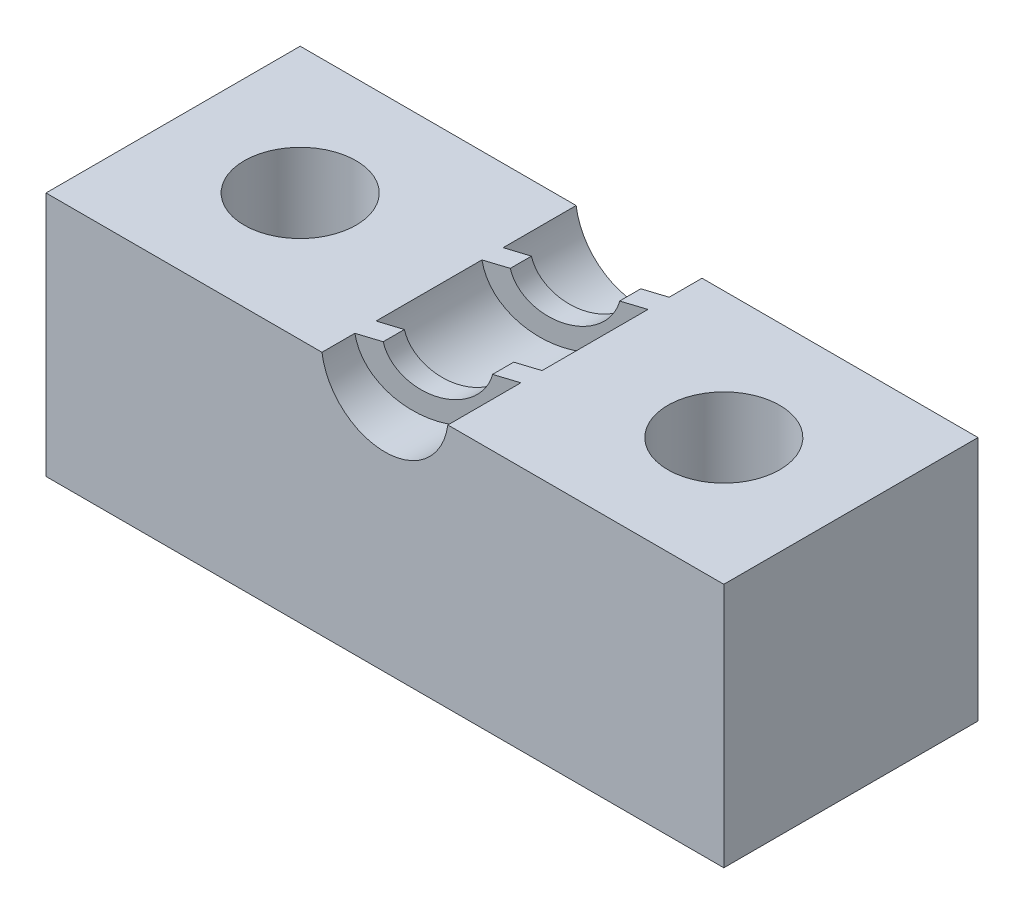
ISO-10303-21;
HEADER;
FILE_DESCRIPTION(('STEP AP214'),'2;1');
FILE_NAME('part.step','',(''),(''),'','','');
FILE_SCHEMA(('AUTOMOTIVE_DESIGN { 1 0 10303 214 1 1 1 1 }'));
ENDSEC;
DATA;
#1=APPLICATION_CONTEXT('core data for automotive mechanical design processes');
#2=APPLICATION_PROTOCOL_DEFINITION('international standard','automotive_design',2000,#1);
#3=PRODUCT_CONTEXT('',#1,'mechanical');
#4=PRODUCT('Part','Part','',(#3));
#5=PRODUCT_RELATED_PRODUCT_CATEGORY('part','',(#4));
#6=PRODUCT_DEFINITION_FORMATION('','',#4);
#7=PRODUCT_DEFINITION_CONTEXT('part definition',#1,'design');
#8=PRODUCT_DEFINITION('design','',#6,#7);
#9=PRODUCT_DEFINITION_SHAPE('','',#8);
#10=(LENGTH_UNIT() NAMED_UNIT(*) SI_UNIT(.MILLI.,.METRE.));
#11=(NAMED_UNIT(*) PLANE_ANGLE_UNIT() SI_UNIT($,.RADIAN.));
#12=(NAMED_UNIT(*) SI_UNIT($,.STERADIAN.) SOLID_ANGLE_UNIT());
#13=UNCERTAINTY_MEASURE_WITH_UNIT(LENGTH_MEASURE(1.E-05),#10,'distance_accuracy_value','');
#14=(GEOMETRIC_REPRESENTATION_CONTEXT(3) GLOBAL_UNCERTAINTY_ASSIGNED_CONTEXT((#13)) GLOBAL_UNIT_ASSIGNED_CONTEXT((#10,
#11,#12)) REPRESENTATION_CONTEXT('',''));
#15=CARTESIAN_POINT('',(0.,0.,0.));
#16=DIRECTION('',(0.,0.,1.));
#17=DIRECTION('',(1.,0.,0.));
#18=AXIS2_PLACEMENT_3D('',#15,#16,#17);
#19=CARTESIAN_POINT('',(0.,0.,3.));
#20=DIRECTION('',(0.,0.,-1.));
#21=DIRECTION('',(-1.,0.,0.));
#22=AXIS2_PLACEMENT_3D('',#19,#20,#21);
#23=CYLINDRICAL_SURFACE('',#22,1.5);
#24=CARTESIAN_POINT('',(0.,0.,-3.));
#25=DIRECTION('',(0.,0.,1.));
#26=DIRECTION('',(1.,0.,0.));
#27=AXIS2_PLACEMENT_3D('',#24,#25,#26);
#28=CIRCLE('',#27,1.5);
#29=CARTESIAN_POINT('',(-1.48607724633712,-0.203898057663877,-3.));
#30=VERTEX_POINT('',#29);
#31=CARTESIAN_POINT('',(1.48607724633711,-0.203898057663877,-3.));
#32=VERTEX_POINT('',#31);
#33=EDGE_CURVE('E178',#30,#32,#28,.T.);
#34=ORIENTED_EDGE('',*,*,#33,.F.);
#35=DIRECTION('',(0.,0.,-1.));
#36=VECTOR('',#35,1.);
#37=CARTESIAN_POINT('',(-1.48607724633712,-0.203898057663877,3.));
#38=LINE('',#37,#36);
#39=CARTESIAN_POINT('',(-1.48607724633712,-0.203898057663876,-1.27687514451344));
#40=VERTEX_POINT('',#39);
#41=EDGE_CURVE('E257',#30,#40,#38,.F.);
#42=ORIENTED_EDGE('',*,*,#41,.T.);
#43=CARTESIAN_POINT('',(0.,0.,-1.75));
#44=DIRECTION('',(-0.303367903708314,0.,-0.952873504196451));
#45=DIRECTION('',(0.952873504196451,0.,-0.303367903708314));
#46=AXIS2_PLACEMENT_3D('',#43,#44,#45);
#47=ELLIPSE('',#46,1.57418586348976,1.5);
#48=CARTESIAN_POINT('',(1.48607724633711,-0.203898057663876,-2.22312485548656));
#49=VERTEX_POINT('',#48);
#50=EDGE_CURVE('E284',#49,#40,#47,.T.);
#51=ORIENTED_EDGE('',*,*,#50,.F.);
#52=DIRECTION('',(0.,0.,-1.));
#53=VECTOR('',#52,1.);
#54=CARTESIAN_POINT('',(1.48607724633711,-0.203898057663877,3.));
#55=LINE('',#54,#53);
#56=EDGE_CURVE('E62',#32,#49,#55,.F.);
#57=ORIENTED_EDGE('',*,*,#56,.F.);
#58=EDGE_LOOP('',(#34,#42,#51,#57));
#59=FACE_BOUND('',#58,.T.);
#60=ADVANCED_FACE('F38',(#59),#23,.F.);
#61=CARTESIAN_POINT('',(0.,0.,1.75));
#62=DIRECTION('',(0.303367903708314,0.,0.952873504196451));
#63=DIRECTION('',(0.952873504196451,0.,-0.303367903708314));
#64=AXIS2_PLACEMENT_3D('',#61,#62,#63);
#65=ELLIPSE('',#64,1.57418586348976,1.5);
#66=CARTESIAN_POINT('',(-1.48607724633712,-0.203898057663877,2.22312485548656));
#67=VERTEX_POINT('',#66);
#68=CARTESIAN_POINT('',(1.48607724633711,-0.203898057663876,1.27687514451344));
#69=VERTEX_POINT('',#68);
#70=EDGE_CURVE('E195',#67,#69,#65,.T.);
#71=ORIENTED_EDGE('',*,*,#70,.F.);
#72=CARTESIAN_POINT('',(-1.48607724633712,-0.203898057663877,3.));
#73=VERTEX_POINT('',#72);
#74=EDGE_CURVE('E262',#67,#73,#38,.F.);
#75=ORIENTED_EDGE('',*,*,#74,.T.);
#76=CARTESIAN_POINT('',(0.,0.,3.));
#77=DIRECTION('',(0.,0.,1.));
#78=DIRECTION('',(1.,0.,0.));
#79=AXIS2_PLACEMENT_3D('',#76,#77,#78);
#80=CIRCLE('',#79,1.5);
#81=CARTESIAN_POINT('',(1.48607724633711,-0.203898057663877,3.));
#82=VERTEX_POINT('',#81);
#83=EDGE_CURVE('E186',#73,#82,#80,.T.);
#84=ORIENTED_EDGE('',*,*,#83,.T.);
#85=EDGE_CURVE('E145',#69,#82,#55,.F.);
#86=ORIENTED_EDGE('',*,*,#85,.F.);
#87=EDGE_LOOP('',(#71,#75,#84,#86));
#88=FACE_BOUND('',#87,.T.);
#89=ADVANCED_FACE('F320',(#88),#23,.F.);
#90=CARTESIAN_POINT('',(0.,0.,3.));
#91=DIRECTION('',(0.,0.,-1.));
#92=DIRECTION('',(-1.,0.,0.));
#93=AXIS2_PLACEMENT_3D('',#90,#91,#92);
#94=PLANE('',#93);
#95=DIRECTION('',(-1.,0.,0.));
#96=VECTOR('',#95,1.);
#97=CARTESIAN_POINT('',(0.,-0.203898057663877,3.));
#98=LINE('',#97,#96);
#99=CARTESIAN_POINT('',(-8.,-0.203898057663878,3.));
#100=VERTEX_POINT('',#99);
#101=EDGE_CURVE('E151',#73,#100,#98,.T.);
#102=ORIENTED_EDGE('',*,*,#101,.T.);
#103=DIRECTION('',(0.,-1.,0.));
#104=VECTOR('',#103,1.);
#105=CARTESIAN_POINT('',(-8.,-6.,3.));
#106=LINE('',#105,#104);
#107=CARTESIAN_POINT('',(-8.,-6.,3.));
#108=VERTEX_POINT('',#107);
#109=EDGE_CURVE('E169',#100,#108,#106,.T.);
#110=ORIENTED_EDGE('',*,*,#109,.T.);
#111=DIRECTION('',(1.,0.,0.));
#112=VECTOR('',#111,1.);
#113=CARTESIAN_POINT('',(-8.,-6.,3.));
#114=LINE('',#113,#112);
#115=CARTESIAN_POINT('',(8.,-6.,3.));
#116=VERTEX_POINT('',#115);
#117=EDGE_CURVE('E166',#108,#116,#114,.T.);
#118=ORIENTED_EDGE('',*,*,#117,.T.);
#119=DIRECTION('',(0.,1.,0.));
#120=VECTOR('',#119,1.);
#121=CARTESIAN_POINT('',(8.,-6.,3.));
#122=LINE('',#121,#120);
#123=CARTESIAN_POINT('',(8.,-0.203898057663877,3.));
#124=VERTEX_POINT('',#123);
#125=EDGE_CURVE('E157',#116,#124,#122,.T.);
#126=ORIENTED_EDGE('',*,*,#125,.T.);
#127=DIRECTION('',(1.,0.,0.));
#128=VECTOR('',#127,1.);
#129=CARTESIAN_POINT('',(0.,-0.203898057663877,3.));
#130=LINE('',#129,#128);
#131=EDGE_CURVE('E139',#82,#124,#130,.T.);
#132=ORIENTED_EDGE('',*,*,#131,.F.);
#133=ORIENTED_EDGE('',*,*,#83,.F.);
#134=EDGE_LOOP('',(#102,#110,#118,#126,#132,#133));
#135=FACE_BOUND('',#134,.T.);
#136=ADVANCED_FACE('F164',(#135),#94,.F.);
#137=CARTESIAN_POINT('',(0.,0.,-3.));
#138=DIRECTION('',(0.,0.,-1.));
#139=DIRECTION('',(-1.,0.,0.));
#140=AXIS2_PLACEMENT_3D('',#137,#138,#139);
#141=PLANE('',#140);
#142=DIRECTION('',(0.,-1.,0.));
#143=VECTOR('',#142,1.);
#144=CARTESIAN_POINT('',(-8.,-6.,-3.));
#145=LINE('',#144,#143);
#146=CARTESIAN_POINT('',(-8.,-0.203898057663878,-3.));
#147=VERTEX_POINT('',#146);
#148=CARTESIAN_POINT('',(-8.,-6.,-3.));
#149=VERTEX_POINT('',#148);
#150=EDGE_CURVE('E175',#147,#149,#145,.T.);
#151=ORIENTED_EDGE('',*,*,#150,.F.);
#152=DIRECTION('',(-1.,0.,0.));
#153=VECTOR('',#152,1.);
#154=CARTESIAN_POINT('',(0.,-0.203898057663877,-3.));
#155=LINE('',#154,#153);
#156=EDGE_CURVE('E230',#30,#147,#155,.T.);
#157=ORIENTED_EDGE('',*,*,#156,.F.);
#158=ORIENTED_EDGE('',*,*,#33,.T.);
#159=DIRECTION('',(1.,0.,0.));
#160=VECTOR('',#159,1.);
#161=CARTESIAN_POINT('',(0.,-0.203898057663877,-3.));
#162=LINE('',#161,#160);
#163=CARTESIAN_POINT('',(8.,-0.203898057663877,-3.));
#164=VERTEX_POINT('',#163);
#165=EDGE_CURVE('E227',#32,#164,#162,.T.);
#166=ORIENTED_EDGE('',*,*,#165,.T.);
#167=DIRECTION('',(0.,1.,0.));
#168=VECTOR('',#167,1.);
#169=CARTESIAN_POINT('',(8.,-6.,-3.));
#170=LINE('',#169,#168);
#171=CARTESIAN_POINT('',(8.,-6.,-3.));
#172=VERTEX_POINT('',#171);
#173=EDGE_CURVE('E159',#172,#164,#170,.T.);
#174=ORIENTED_EDGE('',*,*,#173,.F.);
#175=DIRECTION('',(1.,0.,0.));
#176=VECTOR('',#175,1.);
#177=CARTESIAN_POINT('',(-8.,-6.,-3.));
#178=LINE('',#177,#176);
#179=EDGE_CURVE('E170',#149,#172,#178,.T.);
#180=ORIENTED_EDGE('',*,*,#179,.F.);
#181=EDGE_LOOP('',(#151,#157,#158,#166,#174,#180));
#182=FACE_BOUND('',#181,.T.);
#183=ADVANCED_FACE('F300',(#182),#141,.T.);
#184=CARTESIAN_POINT('',(-8.,-6.,3.));
#185=DIRECTION('',(1.,0.,0.));
#186=DIRECTION('',(0.,0.,-1.));
#187=AXIS2_PLACEMENT_3D('',#184,#185,#186);
#188=PLANE('',#187);
#189=DIRECTION('',(0.,0.,1.));
#190=VECTOR('',#189,1.);
#191=CARTESIAN_POINT('',(-8.,-0.203898057663878,-3.));
#192=LINE('',#191,#190);
#193=EDGE_CURVE('E161',#147,#100,#192,.T.);
#194=ORIENTED_EDGE('',*,*,#193,.F.);
#195=ORIENTED_EDGE('',*,*,#150,.T.);
#196=DIRECTION('',(0.,0.,-1.));
#197=VECTOR('',#196,1.);
#198=CARTESIAN_POINT('',(-8.,-6.,3.));
#199=LINE('',#198,#197);
#200=EDGE_CURVE('E191',#108,#149,#199,.T.);
#201=ORIENTED_EDGE('',*,*,#200,.F.);
#202=ORIENTED_EDGE('',*,*,#109,.F.);
#203=EDGE_LOOP('',(#194,#195,#201,#202));
#204=FACE_BOUND('',#203,.T.);
#205=ADVANCED_FACE('F326',(#204),#188,.F.);
#206=CARTESIAN_POINT('',(0.505874665567726,-9.33427045426016,1.58894385124934));
#207=DIRECTION('',(0.303367903708314,0.,0.952873504196451));
#208=DIRECTION('',(0.952873504196451,0.,-0.303367903708314));
#209=AXIS2_PLACEMENT_3D('',#206,#207,#208);
#210=PLANE('',#209);
#211=CARTESIAN_POINT('',(0.,0.,1.75));
#212=DIRECTION('',(0.303367903708314,0.,0.952873504196451));
#213=DIRECTION('',(-0.952873504196451,0.,0.303367903708314));
#214=AXIS2_PLACEMENT_3D('',#211,#212,#213);
#215=ELLIPSE('',#214,1.0494572423265,1.);
#216=CARTESIAN_POINT('',(-0.978992125648055,-0.203898057663877,2.06168333214937));
#217=VERTEX_POINT('',#216);
#218=CARTESIAN_POINT('',(0.978992125648056,-0.203898057663877,1.43831666785063));
#219=VERTEX_POINT('',#218);
#220=EDGE_CURVE('E277',#217,#219,#215,.T.);
#221=ORIENTED_EDGE('',*,*,#220,.F.);
#222=DIRECTION('',(-0.952873504196451,0.,0.303367903708314));
#223=VECTOR('',#222,1.);
#224=CARTESIAN_POINT('',(0.505874665567725,-0.203898057663876,1.58894385124934));
#225=LINE('',#224,#223);
#226=EDGE_CURVE('E270',#217,#67,#225,.T.);
#227=ORIENTED_EDGE('',*,*,#226,.T.);
#228=ORIENTED_EDGE('',*,*,#70,.T.);
#229=DIRECTION('',(0.952873504196451,0.,-0.303367903708314));
#230=VECTOR('',#229,1.);
#231=CARTESIAN_POINT('',(0.505874665567726,-0.203898057663876,1.58894385124934));
#232=LINE('',#231,#230);
#233=EDGE_CURVE('E254',#219,#69,#232,.T.);
#234=ORIENTED_EDGE('',*,*,#233,.F.);
#235=EDGE_LOOP('',(#221,#227,#228,#234));
#236=FACE_BOUND('',#235,.T.);
#237=ADVANCED_FACE('F374',(#236),#210,.T.);
#238=CARTESIAN_POINT('',(-0.505874665567727,-9.33427045426016,-1.58894385124934));
#239=DIRECTION('',(-0.303367903708314,0.,-0.952873504196451));
#240=DIRECTION('',(-0.952873504196451,0.,0.303367903708314));
#241=AXIS2_PLACEMENT_3D('',#238,#239,#240);
#242=PLANE('',#241);
#243=ORIENTED_EDGE('',*,*,#50,.T.);
#244=DIRECTION('',(0.952873504196451,0.,-0.303367903708314));
#245=VECTOR('',#244,1.);
#246=CARTESIAN_POINT('',(-0.505874665567728,-0.203898057663876,-1.58894385124934));
#247=LINE('',#246,#245);
#248=CARTESIAN_POINT('',(-0.978992125648055,-0.203898057663877,-1.43831666785063));
#249=VERTEX_POINT('',#248);
#250=EDGE_CURVE('E11',#40,#249,#247,.T.);
#251=ORIENTED_EDGE('',*,*,#250,.T.);
#252=CARTESIAN_POINT('',(0.,0.,-1.75));
#253=DIRECTION('',(-0.303367903708314,0.,-0.952873504196451));
#254=DIRECTION('',(-0.952873504196451,0.,0.303367903708314));
#255=AXIS2_PLACEMENT_3D('',#252,#253,#254);
#256=ELLIPSE('',#255,1.0494572423265,1.);
#257=CARTESIAN_POINT('',(0.978992125648056,-0.203898057663877,-2.06168333214937));
#258=VERTEX_POINT('',#257);
#259=EDGE_CURVE('E48',#258,#249,#256,.T.);
#260=ORIENTED_EDGE('',*,*,#259,.F.);
#261=DIRECTION('',(-0.952873504196451,0.,0.303367903708314));
#262=VECTOR('',#261,1.);
#263=CARTESIAN_POINT('',(-0.505874665567727,-0.203898057663876,-1.58894385124934));
#264=LINE('',#263,#262);
#265=EDGE_CURVE('E203',#49,#258,#264,.T.);
#266=ORIENTED_EDGE('',*,*,#265,.F.);
#267=EDGE_LOOP('',(#243,#251,#260,#266));
#268=FACE_BOUND('',#267,.T.);
#269=ADVANCED_FACE('F304',(#268),#242,.T.);
#270=CARTESIAN_POINT('',(8.,-6.,3.));
#271=DIRECTION('',(-1.,0.,0.));
#272=DIRECTION('',(0.,0.,1.));
#273=AXIS2_PLACEMENT_3D('',#270,#271,#272);
#274=PLANE('',#273);
#275=ORIENTED_EDGE('',*,*,#173,.T.);
#276=DIRECTION('',(0.,0.,1.));
#277=VECTOR('',#276,1.);
#278=CARTESIAN_POINT('',(8.,-0.203898057663877,-3.));
#279=LINE('',#278,#277);
#280=EDGE_CURVE('E142',#164,#124,#279,.T.);
#281=ORIENTED_EDGE('',*,*,#280,.T.);
#282=ORIENTED_EDGE('',*,*,#125,.F.);
#283=DIRECTION('',(0.,0.,-1.));
#284=VECTOR('',#283,1.);
#285=CARTESIAN_POINT('',(8.,-6.,3.));
#286=LINE('',#285,#284);
#287=EDGE_CURVE('E183',#116,#172,#286,.T.);
#288=ORIENTED_EDGE('',*,*,#287,.T.);
#289=EDGE_LOOP('',(#275,#281,#282,#288));
#290=FACE_BOUND('',#289,.T.);
#291=ADVANCED_FACE('F40',(#290),#274,.F.);
#292=CARTESIAN_POINT('',(-8.,-6.,3.));
#293=DIRECTION('',(0.,1.,0.));
#294=DIRECTION('',(0.,0.,1.));
#295=AXIS2_PLACEMENT_3D('',#292,#293,#294);
#296=PLANE('',#295);
#297=CARTESIAN_POINT('',(-5.,-6.,0.));
#298=DIRECTION('',(0.,1.,0.));
#299=DIRECTION('',(0.,0.,1.));
#300=AXIS2_PLACEMENT_3D('',#297,#298,#299);
#301=CIRCLE('',#300,1.32);
#302=CARTESIAN_POINT('',(-5.,-6.,1.32));
#303=VERTEX_POINT('',#302);
#304=EDGE_CURVE('E210',#303,#303,#301,.T.);
#305=ORIENTED_EDGE('',*,*,#304,.T.);
#306=EDGE_LOOP('',(#305));
#307=FACE_BOUND('',#306,.T.);
#308=CARTESIAN_POINT('',(5.,-6.,0.));
#309=DIRECTION('',(0.,1.,0.));
#310=DIRECTION('',(0.,0.,1.));
#311=AXIS2_PLACEMENT_3D('',#308,#309,#310);
#312=CIRCLE('',#311,1.32);
#313=CARTESIAN_POINT('',(5.,-6.,1.32));
#314=VERTEX_POINT('',#313);
#315=EDGE_CURVE('E217',#314,#314,#312,.T.);
#316=ORIENTED_EDGE('',*,*,#315,.T.);
#317=EDGE_LOOP('',(#316));
#318=FACE_BOUND('',#317,.T.);
#319=ORIENTED_EDGE('',*,*,#179,.T.);
#320=ORIENTED_EDGE('',*,*,#287,.F.);
#321=ORIENTED_EDGE('',*,*,#117,.F.);
#322=ORIENTED_EDGE('',*,*,#200,.T.);
#323=EDGE_LOOP('',(#319,#320,#321,#322));
#324=FACE_BOUND('',#323,.T.);
#325=ADVANCED_FACE('F329',(#307,#318,#324),#296,.F.);
#326=CARTESIAN_POINT('',(0.,0.,-3.));
#327=DIRECTION('',(0.,0.,1.));
#328=DIRECTION('',(1.,0.,0.));
#329=AXIS2_PLACEMENT_3D('',#326,#327,#328);
#330=CYLINDRICAL_SURFACE('',#329,1.);
#331=DIRECTION('',(0.,0.,1.));
#332=VECTOR('',#331,1.);
#333=CARTESIAN_POINT('',(-0.978992125648055,-0.203898057663877,-3.));
#334=LINE('',#333,#332);
#335=CARTESIAN_POINT('',(-0.978992125648055,-0.203898057663877,1.56168333214937));
#336=VERTEX_POINT('',#335);
#337=EDGE_CURVE('E234',#336,#217,#334,.T.);
#338=ORIENTED_EDGE('',*,*,#337,.T.);
#339=ORIENTED_EDGE('',*,*,#220,.T.);
#340=DIRECTION('',(0.,0.,1.));
#341=VECTOR('',#340,1.);
#342=CARTESIAN_POINT('',(0.978992125648055,-0.203898057663877,-3.));
#343=LINE('',#342,#341);
#344=CARTESIAN_POINT('',(0.978992125648056,-0.203898057663877,0.938316667850628));
#345=VERTEX_POINT('',#344);
#346=EDGE_CURVE('E233',#345,#219,#343,.T.);
#347=ORIENTED_EDGE('',*,*,#346,.F.);
#348=CARTESIAN_POINT('',(0.,0.,1.25));
#349=DIRECTION('',(0.303367903708314,0.,0.952873504196451));
#350=DIRECTION('',(-0.952873504196451,0.,0.303367903708314));
#351=AXIS2_PLACEMENT_3D('',#348,#349,#350);
#352=ELLIPSE('',#351,1.0494572423265,1.);
#353=EDGE_CURVE('E280',#336,#345,#352,.T.);
#354=ORIENTED_EDGE('',*,*,#353,.F.);
#355=EDGE_LOOP('',(#338,#339,#347,#354));
#356=FACE_BOUND('',#355,.T.);
#357=ADVANCED_FACE('F331',(#356),#330,.F.);
#358=CARTESIAN_POINT('',(0.,-0.203898057663877,-3.));
#359=DIRECTION('',(0.,1.,0.));
#360=DIRECTION('',(-1.,0.,0.));
#361=AXIS2_PLACEMENT_3D('',#358,#359,#360);
#362=PLANE('',#361);
#363=CARTESIAN_POINT('',(-5.,-0.203898057663878,0.));
#364=DIRECTION('',(0.,1.,0.));
#365=DIRECTION('',(-1.,0.,0.));
#366=AXIS2_PLACEMENT_3D('',#363,#364,#365);
#367=CIRCLE('',#366,1.32);
#368=CARTESIAN_POINT('',(-6.32,-0.203898057663878,0.));
#369=VERTEX_POINT('',#368);
#370=EDGE_CURVE('E42',#369,#369,#367,.T.);
#371=ORIENTED_EDGE('',*,*,#370,.F.);
#372=EDGE_LOOP('',(#371));
#373=FACE_BOUND('',#372,.T.);
#374=ORIENTED_EDGE('',*,*,#226,.F.);
#375=ORIENTED_EDGE('',*,*,#337,.F.);
#376=DIRECTION('',(-0.952873504196451,0.,0.303367903708314));
#377=VECTOR('',#376,1.);
#378=CARTESIAN_POINT('',(0.361339046834089,-0.203898057663876,1.13495989374953));
#379=LINE('',#378,#377);
#380=CARTESIAN_POINT('',(-1.48607724633712,-0.203898057663877,1.72312485548656));
#381=VERTEX_POINT('',#380);
#382=EDGE_CURVE('E267',#336,#381,#379,.T.);
#383=ORIENTED_EDGE('',*,*,#382,.T.);
#384=CARTESIAN_POINT('',(-1.48607724633712,-0.203898057663877,-0.776875144513445));
#385=VERTEX_POINT('',#384);
#386=EDGE_CURVE('E263',#385,#381,#38,.F.);
#387=ORIENTED_EDGE('',*,*,#386,.F.);
#388=DIRECTION('',(-0.952873504196451,0.,0.303367903708314));
#389=VECTOR('',#388,1.);
#390=CARTESIAN_POINT('',(-0.361339046834092,-0.203898057663876,-1.13495989374953));
#391=LINE('',#390,#389);
#392=CARTESIAN_POINT('',(-0.978992125648055,-0.203898057663877,-0.938316667850631));
#393=VERTEX_POINT('',#392);
#394=EDGE_CURVE('E261',#393,#385,#391,.T.);
#395=ORIENTED_EDGE('',*,*,#394,.F.);
#396=EDGE_CURVE('E238',#249,#393,#334,.T.);
#397=ORIENTED_EDGE('',*,*,#396,.F.);
#398=ORIENTED_EDGE('',*,*,#250,.F.);
#399=ORIENTED_EDGE('',*,*,#41,.F.);
#400=ORIENTED_EDGE('',*,*,#156,.T.);
#401=ORIENTED_EDGE('',*,*,#193,.T.);
#402=ORIENTED_EDGE('',*,*,#101,.F.);
#403=ORIENTED_EDGE('',*,*,#74,.F.);
#404=EDGE_LOOP('',(#374,#375,#383,#387,#395,#397,#398,#399,#400,#401,#402,#403));
#405=FACE_BOUND('',#404,.T.);
#406=ADVANCED_FACE('F337',(#373,#405),#362,.T.);
#407=CARTESIAN_POINT('',(0.,-0.203898057663877,-3.));
#408=DIRECTION('',(0.,-1.,0.));
#409=DIRECTION('',(1.,0.,0.));
#410=AXIS2_PLACEMENT_3D('',#407,#408,#409);
#411=PLANE('',#410);
#412=CARTESIAN_POINT('',(5.,-0.203898057663877,0.));
#413=DIRECTION('',(0.,-1.,0.));
#414=DIRECTION('',(1.,0.,0.));
#415=AXIS2_PLACEMENT_3D('',#412,#413,#414);
#416=CIRCLE('',#415,1.32);
#417=CARTESIAN_POINT('',(6.32,-0.203898057663877,0.));
#418=VERTEX_POINT('',#417);
#419=EDGE_CURVE('E207',#418,#418,#416,.T.);
#420=ORIENTED_EDGE('',*,*,#419,.T.);
#421=EDGE_LOOP('',(#420));
#422=FACE_BOUND('',#421,.T.);
#423=ORIENTED_EDGE('',*,*,#85,.T.);
#424=ORIENTED_EDGE('',*,*,#131,.T.);
#425=ORIENTED_EDGE('',*,*,#280,.F.);
#426=ORIENTED_EDGE('',*,*,#165,.F.);
#427=ORIENTED_EDGE('',*,*,#56,.T.);
#428=ORIENTED_EDGE('',*,*,#265,.T.);
#429=CARTESIAN_POINT('',(0.978992125648055,-0.203898057663876,-1.56168333214937));
#430=VERTEX_POINT('',#429);
#431=EDGE_CURVE('E56',#258,#430,#343,.T.);
#432=ORIENTED_EDGE('',*,*,#431,.T.);
#433=DIRECTION('',(0.952873504196451,0.,-0.303367903708314));
#434=VECTOR('',#433,1.);
#435=CARTESIAN_POINT('',(-0.361339046834091,-0.203898057663876,-1.13495989374953));
#436=LINE('',#435,#434);
#437=CARTESIAN_POINT('',(1.48607724633711,-0.203898057663876,-1.72312485548656));
#438=VERTEX_POINT('',#437);
#439=EDGE_CURVE('E246',#430,#438,#436,.T.);
#440=ORIENTED_EDGE('',*,*,#439,.T.);
#441=CARTESIAN_POINT('',(1.48607724633711,-0.203898057663877,0.776875144513444));
#442=VERTEX_POINT('',#441);
#443=EDGE_CURVE('E247',#438,#442,#55,.F.);
#444=ORIENTED_EDGE('',*,*,#443,.T.);
#445=DIRECTION('',(0.952873504196451,0.,-0.303367903708314));
#446=VECTOR('',#445,1.);
#447=CARTESIAN_POINT('',(0.36133904683409,-0.203898057663876,1.13495989374953));
#448=LINE('',#447,#446);
#449=EDGE_CURVE('E250',#345,#442,#448,.T.);
#450=ORIENTED_EDGE('',*,*,#449,.F.);
#451=ORIENTED_EDGE('',*,*,#346,.T.);
#452=ORIENTED_EDGE('',*,*,#233,.T.);
#453=EDGE_LOOP('',(#423,#424,#425,#426,#427,#428,#432,#440,#444,#450,#451,#452));
#454=FACE_BOUND('',#453,.T.);
#455=ADVANCED_FACE('F141',(#422,#454),#411,.F.);
#456=CARTESIAN_POINT('',(0.,0.,-1.25));
#457=DIRECTION('',(0.303367903708314,0.,0.952873504196451));
#458=DIRECTION('',(-0.952873504196451,0.,0.303367903708314));
#459=AXIS2_PLACEMENT_3D('',#456,#457,#458);
#460=ELLIPSE('',#459,1.0494572423265,1.);
#461=EDGE_CURVE('E274',#393,#430,#460,.T.);
#462=ORIENTED_EDGE('',*,*,#461,.T.);
#463=ORIENTED_EDGE('',*,*,#431,.F.);
#464=ORIENTED_EDGE('',*,*,#259,.T.);
#465=ORIENTED_EDGE('',*,*,#396,.T.);
#466=EDGE_LOOP('',(#462,#463,#464,#465));
#467=FACE_BOUND('',#466,.T.);
#468=ADVANCED_FACE('F307',(#467),#330,.F.);
#469=CARTESIAN_POINT('',(0.36133904683409,-9.33427045426016,1.13495989374953));
#470=DIRECTION('',(0.303367903708314,0.,0.952873504196451));
#471=DIRECTION('',(0.952873504196451,0.,-0.303367903708314));
#472=AXIS2_PLACEMENT_3D('',#469,#470,#471);
#473=PLANE('',#472);
#474=ORIENTED_EDGE('',*,*,#382,.F.);
#475=ORIENTED_EDGE('',*,*,#353,.T.);
#476=ORIENTED_EDGE('',*,*,#449,.T.);
#477=CARTESIAN_POINT('',(0.,0.,1.25));
#478=DIRECTION('',(0.303367903708314,0.,0.952873504196451));
#479=DIRECTION('',(0.952873504196451,0.,-0.303367903708314));
#480=AXIS2_PLACEMENT_3D('',#477,#478,#479);
#481=ELLIPSE('',#480,1.57418586348976,1.5);
#482=EDGE_CURVE('E199',#381,#442,#481,.T.);
#483=ORIENTED_EDGE('',*,*,#482,.F.);
#484=EDGE_LOOP('',(#474,#475,#476,#483));
#485=FACE_BOUND('',#484,.T.);
#486=ADVANCED_FACE('F361',(#485),#473,.F.);
#487=CARTESIAN_POINT('',(-0.361339046834091,-9.33427045426016,-1.13495989374953));
#488=DIRECTION('',(0.303367903708314,0.,0.952873504196451));
#489=DIRECTION('',(0.952873504196451,0.,-0.303367903708314));
#490=AXIS2_PLACEMENT_3D('',#487,#488,#489);
#491=PLANE('',#490);
#492=ORIENTED_EDGE('',*,*,#461,.F.);
#493=ORIENTED_EDGE('',*,*,#394,.T.);
#494=CARTESIAN_POINT('',(0.,0.,-1.25));
#495=DIRECTION('',(0.303367903708314,0.,0.952873504196451));
#496=DIRECTION('',(0.952873504196451,0.,-0.303367903708314));
#497=AXIS2_PLACEMENT_3D('',#494,#495,#496);
#498=ELLIPSE('',#497,1.57418586348976,1.5);
#499=EDGE_CURVE('E288',#385,#438,#498,.T.);
#500=ORIENTED_EDGE('',*,*,#499,.T.);
#501=ORIENTED_EDGE('',*,*,#439,.F.);
#502=EDGE_LOOP('',(#492,#493,#500,#501));
#503=FACE_BOUND('',#502,.T.);
#504=ADVANCED_FACE('F352',(#503),#491,.T.);
#505=ORIENTED_EDGE('',*,*,#499,.F.);
#506=ORIENTED_EDGE('',*,*,#386,.T.);
#507=ORIENTED_EDGE('',*,*,#482,.T.);
#508=ORIENTED_EDGE('',*,*,#443,.F.);
#509=EDGE_LOOP('',(#505,#506,#507,#508));
#510=FACE_BOUND('',#509,.T.);
#511=ADVANCED_FACE('F344',(#510),#23,.F.);
#512=CARTESIAN_POINT('',(5.,-6.,0.));
#513=DIRECTION('',(0.,1.,0.));
#514=DIRECTION('',(0.,0.,1.));
#515=AXIS2_PLACEMENT_3D('',#512,#513,#514);
#516=CYLINDRICAL_SURFACE('',#515,1.32);
#517=ORIENTED_EDGE('',*,*,#315,.F.);
#518=EDGE_LOOP('',(#517));
#519=FACE_BOUND('',#518,.T.);
#520=ORIENTED_EDGE('',*,*,#419,.F.);
#521=EDGE_LOOP('',(#520));
#522=FACE_BOUND('',#521,.T.);
#523=ADVANCED_FACE('F351',(#519,#522),#516,.F.);
#524=CARTESIAN_POINT('',(-5.,-6.,0.));
#525=DIRECTION('',(0.,1.,0.));
#526=DIRECTION('',(0.,0.,1.));
#527=AXIS2_PLACEMENT_3D('',#524,#525,#526);
#528=CYLINDRICAL_SURFACE('',#527,1.32);
#529=ORIENTED_EDGE('',*,*,#370,.T.);
#530=EDGE_LOOP('',(#529));
#531=FACE_BOUND('',#530,.T.);
#532=ORIENTED_EDGE('',*,*,#304,.F.);
#533=EDGE_LOOP('',(#532));
#534=FACE_BOUND('',#533,.T.);
#535=ADVANCED_FACE('F358',(#531,#534),#528,.F.);
#536=CLOSED_SHELL('',(#60,#89,#136,#183,#205,#237,#269,#291,#325,#357,#406,#455,#468,#486,#504,
#511,#523,#535));
#537=MANIFOLD_SOLID_BREP('B2',#536);
#538=ADVANCED_BREP_SHAPE_REPRESENTATION('',(#18,#537),#14);
#539=SHAPE_DEFINITION_REPRESENTATION(#9,#538);
ENDSEC;
END-ISO-10303-21;
